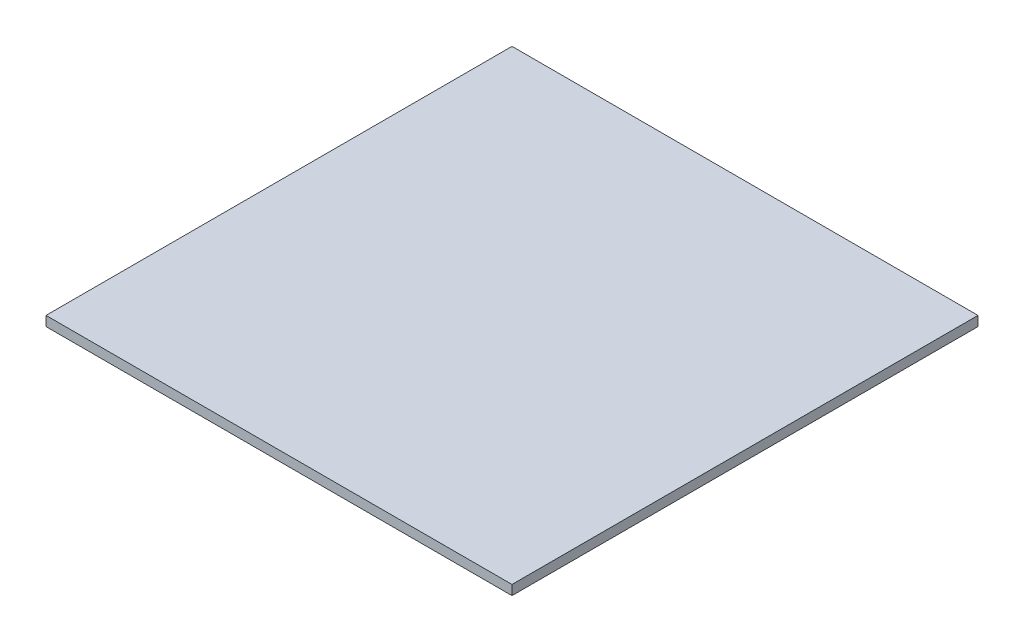
ISO-10303-21;
HEADER;
FILE_DESCRIPTION(('STEP AP214'),'2;1');
FILE_NAME('part.step','',(''),(''),'','','');
FILE_SCHEMA(('AUTOMOTIVE_DESIGN { 1 0 10303 214 1 1 1 1 }'));
ENDSEC;
DATA;
#1=APPLICATION_CONTEXT('core data for automotive mechanical design processes');
#2=APPLICATION_PROTOCOL_DEFINITION('international standard','automotive_design',2000,#1);
#3=PRODUCT_CONTEXT('',#1,'mechanical');
#4=PRODUCT('Part','Part','',(#3));
#5=PRODUCT_RELATED_PRODUCT_CATEGORY('part','',(#4));
#6=PRODUCT_DEFINITION_FORMATION('','',#4);
#7=PRODUCT_DEFINITION_CONTEXT('part definition',#1,'design');
#8=PRODUCT_DEFINITION('design','',#6,#7);
#9=PRODUCT_DEFINITION_SHAPE('','',#8);
#10=(LENGTH_UNIT() NAMED_UNIT(*) SI_UNIT(.MILLI.,.METRE.));
#11=(NAMED_UNIT(*) PLANE_ANGLE_UNIT() SI_UNIT($,.RADIAN.));
#12=(NAMED_UNIT(*) SI_UNIT($,.STERADIAN.) SOLID_ANGLE_UNIT());
#13=UNCERTAINTY_MEASURE_WITH_UNIT(LENGTH_MEASURE(1.E-05),#10,'distance_accuracy_value','');
#14=(GEOMETRIC_REPRESENTATION_CONTEXT(3) GLOBAL_UNCERTAINTY_ASSIGNED_CONTEXT((#13)) GLOBAL_UNIT_ASSIGNED_CONTEXT((#10,
#11,#12)) REPRESENTATION_CONTEXT('',''));
#15=CARTESIAN_POINT('',(0.,0.,0.));
#16=DIRECTION('',(0.,0.,1.));
#17=DIRECTION('',(1.,0.,0.));
#18=AXIS2_PLACEMENT_3D('',#15,#16,#17);
#19=CARTESIAN_POINT('',(609.6,-25.4,609.6));
#20=DIRECTION('',(1.,0.,0.));
#21=DIRECTION('',(0.,0.,-1.));
#22=AXIS2_PLACEMENT_3D('',#19,#20,#21);
#23=PLANE('',#22);
#24=DIRECTION('',(0.,0.,-1.));
#25=VECTOR('',#24,1.);
#26=CARTESIAN_POINT('',(609.6,0.,609.6));
#27=LINE('',#26,#25);
#28=CARTESIAN_POINT('',(609.6,0.,609.6));
#29=VERTEX_POINT('',#28);
#30=CARTESIAN_POINT('',(609.6,0.,-609.6));
#31=VERTEX_POINT('',#30);
#32=EDGE_CURVE('E98',#29,#31,#27,.T.);
#33=ORIENTED_EDGE('',*,*,#32,.F.);
#34=DIRECTION('',(0.,1.,0.));
#35=VECTOR('',#34,1.);
#36=CARTESIAN_POINT('',(609.6,-25.4,609.6));
#37=LINE('',#36,#35);
#38=CARTESIAN_POINT('',(609.6,-25.4,609.6));
#39=VERTEX_POINT('',#38);
#40=EDGE_CURVE('E11',#39,#29,#37,.T.);
#41=ORIENTED_EDGE('',*,*,#40,.F.);
#42=DIRECTION('',(0.,0.,-1.));
#43=VECTOR('',#42,1.);
#44=CARTESIAN_POINT('',(609.6,-25.4,609.6));
#45=LINE('',#44,#43);
#46=CARTESIAN_POINT('',(609.6,-25.4,-609.6));
#47=VERTEX_POINT('',#46);
#48=EDGE_CURVE('E92',#39,#47,#45,.T.);
#49=ORIENTED_EDGE('',*,*,#48,.T.);
#50=DIRECTION('',(0.,1.,0.));
#51=VECTOR('',#50,1.);
#52=CARTESIAN_POINT('',(609.6,-25.4,-609.6));
#53=LINE('',#52,#51);
#54=EDGE_CURVE('E37',#47,#31,#53,.T.);
#55=ORIENTED_EDGE('',*,*,#54,.T.);
#56=EDGE_LOOP('',(#33,#41,#49,#55));
#57=FACE_BOUND('',#56,.T.);
#58=ADVANCED_FACE('F34',(#57),#23,.T.);
#59=CARTESIAN_POINT('',(-609.6,-25.4,609.6));
#60=DIRECTION('',(0.,0.,1.));
#61=DIRECTION('',(1.,0.,0.));
#62=AXIS2_PLACEMENT_3D('',#59,#60,#61);
#63=PLANE('',#62);
#64=DIRECTION('',(1.,0.,0.));
#65=VECTOR('',#64,1.);
#66=CARTESIAN_POINT('',(-609.6,0.,609.6));
#67=LINE('',#66,#65);
#68=CARTESIAN_POINT('',(-609.6,0.,609.6));
#69=VERTEX_POINT('',#68);
#70=EDGE_CURVE('E94',#69,#29,#67,.T.);
#71=ORIENTED_EDGE('',*,*,#70,.F.);
#72=DIRECTION('',(0.,1.,0.));
#73=VECTOR('',#72,1.);
#74=CARTESIAN_POINT('',(-609.6,-25.4,609.6));
#75=LINE('',#74,#73);
#76=CARTESIAN_POINT('',(-609.6,-25.4,609.6));
#77=VERTEX_POINT('',#76);
#78=EDGE_CURVE('E43',#77,#69,#75,.T.);
#79=ORIENTED_EDGE('',*,*,#78,.F.);
#80=DIRECTION('',(1.,0.,0.));
#81=VECTOR('',#80,1.);
#82=CARTESIAN_POINT('',(-609.6,-25.4,609.6));
#83=LINE('',#82,#81);
#84=EDGE_CURVE('E89',#77,#39,#83,.T.);
#85=ORIENTED_EDGE('',*,*,#84,.T.);
#86=ORIENTED_EDGE('',*,*,#40,.T.);
#87=EDGE_LOOP('',(#71,#79,#85,#86));
#88=FACE_BOUND('',#87,.T.);
#89=ADVANCED_FACE('F108',(#88),#63,.T.);
#90=CARTESIAN_POINT('',(-609.6,-25.4,609.6));
#91=DIRECTION('',(-1.,0.,0.));
#92=DIRECTION('',(0.,0.,1.));
#93=AXIS2_PLACEMENT_3D('',#90,#91,#92);
#94=PLANE('',#93);
#95=DIRECTION('',(0.,0.,1.));
#96=VECTOR('',#95,1.);
#97=CARTESIAN_POINT('',(-609.6,0.,609.6));
#98=LINE('',#97,#96);
#99=CARTESIAN_POINT('',(-609.6,0.,-609.6));
#100=VERTEX_POINT('',#99);
#101=EDGE_CURVE('E84',#100,#69,#98,.T.);
#102=ORIENTED_EDGE('',*,*,#101,.F.);
#103=DIRECTION('',(0.,1.,0.));
#104=VECTOR('',#103,1.);
#105=CARTESIAN_POINT('',(-609.6,-25.4,-609.6));
#106=LINE('',#105,#104);
#107=CARTESIAN_POINT('',(-609.6,-25.4,-609.6));
#108=VERTEX_POINT('',#107);
#109=EDGE_CURVE('E79',#108,#100,#106,.T.);
#110=ORIENTED_EDGE('',*,*,#109,.F.);
#111=DIRECTION('',(0.,0.,1.));
#112=VECTOR('',#111,1.);
#113=CARTESIAN_POINT('',(-609.6,-25.4,609.6));
#114=LINE('',#113,#112);
#115=EDGE_CURVE('E82',#108,#77,#114,.T.);
#116=ORIENTED_EDGE('',*,*,#115,.T.);
#117=ORIENTED_EDGE('',*,*,#78,.T.);
#118=EDGE_LOOP('',(#102,#110,#116,#117));
#119=FACE_BOUND('',#118,.T.);
#120=ADVANCED_FACE('F81',(#119),#94,.T.);
#121=CARTESIAN_POINT('',(-609.6,-25.4,-609.6));
#122=DIRECTION('',(0.,0.,-1.));
#123=DIRECTION('',(-1.,0.,0.));
#124=AXIS2_PLACEMENT_3D('',#121,#122,#123);
#125=PLANE('',#124);
#126=DIRECTION('',(-1.,0.,0.));
#127=VECTOR('',#126,1.);
#128=CARTESIAN_POINT('',(-609.6,0.,-609.6));
#129=LINE('',#128,#127);
#130=EDGE_CURVE('E101',#31,#100,#129,.T.);
#131=ORIENTED_EDGE('',*,*,#130,.F.);
#132=ORIENTED_EDGE('',*,*,#54,.F.);
#133=DIRECTION('',(-1.,0.,0.));
#134=VECTOR('',#133,1.);
#135=CARTESIAN_POINT('',(-609.6,-25.4,-609.6));
#136=LINE('',#135,#134);
#137=EDGE_CURVE('E88',#47,#108,#136,.T.);
#138=ORIENTED_EDGE('',*,*,#137,.T.);
#139=ORIENTED_EDGE('',*,*,#109,.T.);
#140=EDGE_LOOP('',(#131,#132,#138,#139));
#141=FACE_BOUND('',#140,.T.);
#142=ADVANCED_FACE('F91',(#141),#125,.T.);
#143=CARTESIAN_POINT('',(0.,-25.4,0.));
#144=DIRECTION('',(0.,-1.,0.));
#145=DIRECTION('',(0.,0.,-1.));
#146=AXIS2_PLACEMENT_3D('',#143,#144,#145);
#147=PLANE('',#146);
#148=ORIENTED_EDGE('',*,*,#48,.F.);
#149=ORIENTED_EDGE('',*,*,#84,.F.);
#150=ORIENTED_EDGE('',*,*,#115,.F.);
#151=ORIENTED_EDGE('',*,*,#137,.F.);
#152=EDGE_LOOP('',(#148,#149,#150,#151));
#153=FACE_BOUND('',#152,.T.);
#154=ADVANCED_FACE('F87',(#153),#147,.T.);
#155=CARTESIAN_POINT('',(0.,0.,0.));
#156=DIRECTION('',(0.,-1.,0.));
#157=DIRECTION('',(0.,0.,-1.));
#158=AXIS2_PLACEMENT_3D('',#155,#156,#157);
#159=PLANE('',#158);
#160=ORIENTED_EDGE('',*,*,#32,.T.);
#161=ORIENTED_EDGE('',*,*,#130,.T.);
#162=ORIENTED_EDGE('',*,*,#101,.T.);
#163=ORIENTED_EDGE('',*,*,#70,.T.);
#164=EDGE_LOOP('',(#160,#161,#162,#163));
#165=FACE_BOUND('',#164,.T.);
#166=ADVANCED_FACE('F107',(#165),#159,.F.);
#167=CLOSED_SHELL('',(#58,#89,#120,#142,#154,#166));
#168=MANIFOLD_SOLID_BREP('B2',#167);
#169=ADVANCED_BREP_SHAPE_REPRESENTATION('',(#18,#168),#14);
#170=SHAPE_DEFINITION_REPRESENTATION(#9,#169);
ENDSEC;
END-ISO-10303-21;
